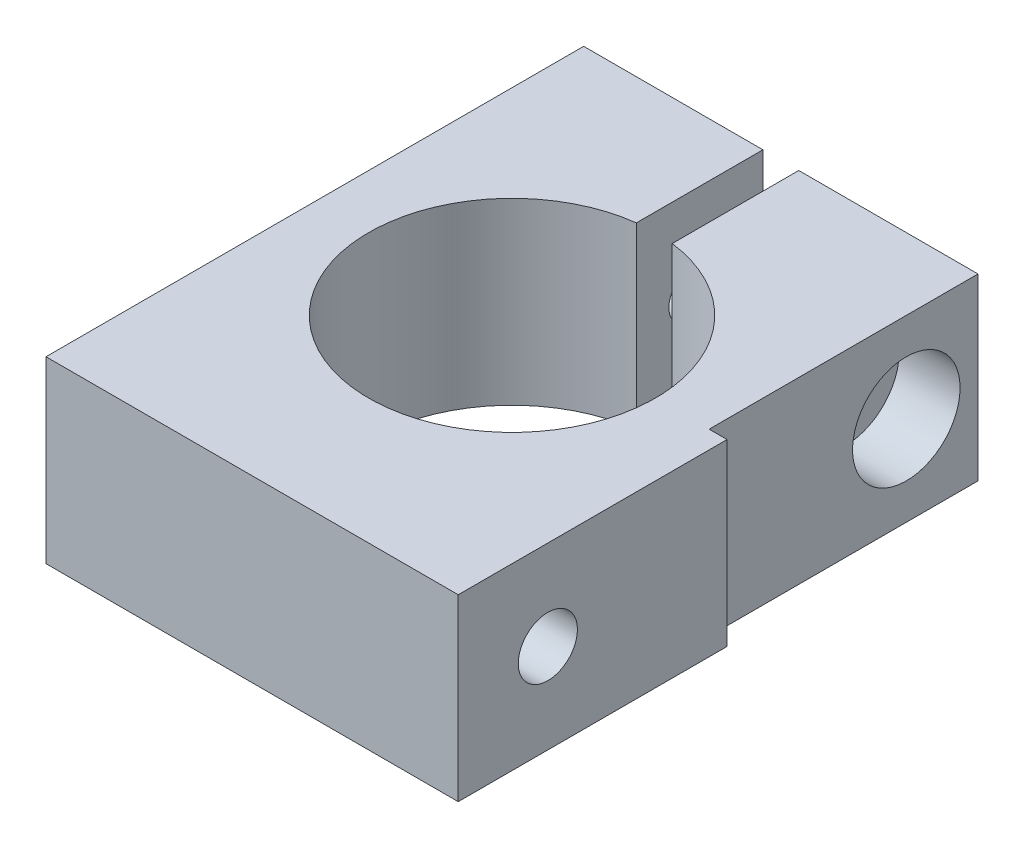
ISO-10303-21;
HEADER;
FILE_DESCRIPTION(('STEP AP214'),'2;1');
FILE_NAME('part.step','',(''),(''),'','','');
FILE_SCHEMA(('AUTOMOTIVE_DESIGN { 1 0 10303 214 1 1 1 1 }'));
ENDSEC;
DATA;
#1=APPLICATION_CONTEXT('core data for automotive mechanical design processes');
#2=APPLICATION_PROTOCOL_DEFINITION('international standard','automotive_design',2000,#1);
#3=PRODUCT_CONTEXT('',#1,'mechanical');
#4=PRODUCT('Part','Part','',(#3));
#5=PRODUCT_RELATED_PRODUCT_CATEGORY('part','',(#4));
#6=PRODUCT_DEFINITION_FORMATION('','',#4);
#7=PRODUCT_DEFINITION_CONTEXT('part definition',#1,'design');
#8=PRODUCT_DEFINITION('design','',#6,#7);
#9=PRODUCT_DEFINITION_SHAPE('','',#8);
#10=(LENGTH_UNIT() NAMED_UNIT(*) SI_UNIT(.MILLI.,.METRE.));
#11=(NAMED_UNIT(*) PLANE_ANGLE_UNIT() SI_UNIT($,.RADIAN.));
#12=(NAMED_UNIT(*) SI_UNIT($,.STERADIAN.) SOLID_ANGLE_UNIT());
#13=UNCERTAINTY_MEASURE_WITH_UNIT(LENGTH_MEASURE(1.E-05),#10,'distance_accuracy_value','');
#14=(GEOMETRIC_REPRESENTATION_CONTEXT(3) GLOBAL_UNCERTAINTY_ASSIGNED_CONTEXT((#13)) GLOBAL_UNIT_ASSIGNED_CONTEXT((#10,
#11,#12)) REPRESENTATION_CONTEXT('',''));
#15=CARTESIAN_POINT('',(0.,0.,0.));
#16=DIRECTION('',(0.,0.,1.));
#17=DIRECTION('',(1.,0.,0.));
#18=AXIS2_PLACEMENT_3D('',#15,#16,#17);
#19=CARTESIAN_POINT('',(11.,5.,15.));
#20=DIRECTION('',(-1.,0.,0.));
#21=DIRECTION('',(0.,0.,1.));
#22=AXIS2_PLACEMENT_3D('',#19,#20,#21);
#23=PLANE('',#22);
#24=CARTESIAN_POINT('',(11.,0.,-11.));
#25=DIRECTION('',(1.,0.,0.));
#26=DIRECTION('',(0.,0.,-1.));
#27=AXIS2_PLACEMENT_3D('',#24,#25,#26);
#28=CIRCLE('',#27,3.);
#29=CARTESIAN_POINT('',(11.,0.,-14.));
#30=VERTEX_POINT('',#29);
#31=EDGE_CURVE('E235',#30,#30,#28,.T.);
#32=ORIENTED_EDGE('',*,*,#31,.F.);
#33=EDGE_LOOP('',(#32));
#34=FACE_BOUND('',#33,.T.);
#35=DIRECTION('',(0.,1.,0.));
#36=VECTOR('',#35,1.);
#37=CARTESIAN_POINT('',(11.,-4.99999999999999,0.));
#38=LINE('',#37,#36);
#39=CARTESIAN_POINT('',(11.,-4.99999999999999,0.));
#40=VERTEX_POINT('',#39);
#41=CARTESIAN_POINT('',(11.,5.,0.));
#42=VERTEX_POINT('',#41);
#43=EDGE_CURVE('E87',#40,#42,#38,.T.);
#44=ORIENTED_EDGE('',*,*,#43,.F.);
#45=DIRECTION('',(0.,0.,-1.));
#46=VECTOR('',#45,1.);
#47=CARTESIAN_POINT('',(11.,-5.,15.));
#48=LINE('',#47,#46);
#49=CARTESIAN_POINT('',(11.,-5.,-15.));
#50=VERTEX_POINT('',#49);
#51=EDGE_CURVE('E204',#40,#50,#48,.T.);
#52=ORIENTED_EDGE('',*,*,#51,.T.);
#53=DIRECTION('',(0.,-1.,0.));
#54=VECTOR('',#53,1.);
#55=CARTESIAN_POINT('',(11.,4.99999999999999,-15.));
#56=LINE('',#55,#54);
#57=CARTESIAN_POINT('',(11.,4.99999999999999,-15.));
#58=VERTEX_POINT('',#57);
#59=EDGE_CURVE('E243',#58,#50,#56,.T.);
#60=ORIENTED_EDGE('',*,*,#59,.F.);
#61=DIRECTION('',(0.,0.,-1.));
#62=VECTOR('',#61,1.);
#63=CARTESIAN_POINT('',(11.,5.,15.));
#64=LINE('',#63,#62);
#65=EDGE_CURVE('E213',#42,#58,#64,.T.);
#66=ORIENTED_EDGE('',*,*,#65,.F.);
#67=EDGE_LOOP('',(#44,#52,#60,#66));
#68=FACE_BOUND('',#67,.T.);
#69=ADVANCED_FACE('F66',(#34,#68),#23,.F.);
#70=CARTESIAN_POINT('',(-1.,5.,-15.));
#71=DIRECTION('',(0.,0.,1.));
#72=DIRECTION('',(1.,0.,0.));
#73=AXIS2_PLACEMENT_3D('',#70,#71,#72);
#74=PLANE('',#73);
#75=DIRECTION('',(-1.,0.,0.));
#76=VECTOR('',#75,1.);
#77=CARTESIAN_POINT('',(-1.,-4.99999999999999,-15.));
#78=LINE('',#77,#76);
#79=CARTESIAN_POINT('',(-1.,-4.99999999999999,-15.));
#80=VERTEX_POINT('',#79);
#81=CARTESIAN_POINT('',(-11.,-5.,-15.));
#82=VERTEX_POINT('',#81);
#83=EDGE_CURVE('E193',#80,#82,#78,.T.);
#84=ORIENTED_EDGE('',*,*,#83,.T.);
#85=DIRECTION('',(0.,-1.,0.));
#86=VECTOR('',#85,1.);
#87=CARTESIAN_POINT('',(-11.,5.,-15.));
#88=LINE('',#87,#86);
#89=CARTESIAN_POINT('',(-11.,5.,-15.));
#90=VERTEX_POINT('',#89);
#91=EDGE_CURVE('E14',#90,#82,#88,.T.);
#92=ORIENTED_EDGE('',*,*,#91,.F.);
#93=DIRECTION('',(-1.,0.,0.));
#94=VECTOR('',#93,1.);
#95=CARTESIAN_POINT('',(-1.,5.,-15.));
#96=LINE('',#95,#94);
#97=CARTESIAN_POINT('',(-1.,5.,-15.));
#98=VERTEX_POINT('',#97);
#99=EDGE_CURVE('E277',#98,#90,#96,.T.);
#100=ORIENTED_EDGE('',*,*,#99,.F.);
#101=DIRECTION('',(0.,-1.,0.));
#102=VECTOR('',#101,1.);
#103=CARTESIAN_POINT('',(-1.,5.,-15.));
#104=LINE('',#103,#102);
#105=EDGE_CURVE('E189',#98,#80,#104,.T.);
#106=ORIENTED_EDGE('',*,*,#105,.T.);
#107=EDGE_LOOP('',(#84,#92,#100,#106));
#108=FACE_BOUND('',#107,.T.);
#109=ADVANCED_FACE('F68',(#108),#74,.F.);
#110=CARTESIAN_POINT('',(-11.,5.,15.));
#111=DIRECTION('',(1.,0.,0.));
#112=DIRECTION('',(0.,0.,-1.));
#113=AXIS2_PLACEMENT_3D('',#110,#111,#112);
#114=PLANE('',#113);
#115=CARTESIAN_POINT('',(-11.,0.,-11.));
#116=DIRECTION('',(-1.,0.,0.));
#117=DIRECTION('',(0.,0.,1.));
#118=AXIS2_PLACEMENT_3D('',#115,#116,#117);
#119=CIRCLE('',#118,1.24999999999999);
#120=CARTESIAN_POINT('',(-11.,0.,-9.75000000000001));
#121=VERTEX_POINT('',#120);
#122=EDGE_CURVE('E261',#121,#121,#119,.T.);
#123=ORIENTED_EDGE('',*,*,#122,.F.);
#124=EDGE_LOOP('',(#123));
#125=FACE_BOUND('',#124,.T.);
#126=DIRECTION('',(0.,0.,1.));
#127=VECTOR('',#126,1.);
#128=CARTESIAN_POINT('',(-11.,-4.99999999999999,15.));
#129=LINE('',#128,#127);
#130=CARTESIAN_POINT('',(-11.,-4.99999999999999,15.));
#131=VERTEX_POINT('',#130);
#132=EDGE_CURVE('E197',#82,#131,#129,.T.);
#133=ORIENTED_EDGE('',*,*,#132,.T.);
#134=DIRECTION('',(0.,-1.,0.));
#135=VECTOR('',#134,1.);
#136=CARTESIAN_POINT('',(-11.,5.,15.));
#137=LINE('',#136,#135);
#138=CARTESIAN_POINT('',(-11.,5.,15.));
#139=VERTEX_POINT('',#138);
#140=EDGE_CURVE('E76',#139,#131,#137,.T.);
#141=ORIENTED_EDGE('',*,*,#140,.F.);
#142=DIRECTION('',(0.,0.,1.));
#143=VECTOR('',#142,1.);
#144=CARTESIAN_POINT('',(-11.,5.,15.));
#145=LINE('',#144,#143);
#146=EDGE_CURVE('E145',#90,#139,#145,.T.);
#147=ORIENTED_EDGE('',*,*,#146,.F.);
#148=ORIENTED_EDGE('',*,*,#91,.T.);
#149=EDGE_LOOP('',(#133,#141,#147,#148));
#150=FACE_BOUND('',#149,.T.);
#151=ADVANCED_FACE('F312',(#125,#150),#114,.F.);
#152=CARTESIAN_POINT('',(11.,5.,15.));
#153=DIRECTION('',(0.,0.,-1.));
#154=DIRECTION('',(-1.,0.,0.));
#155=AXIS2_PLACEMENT_3D('',#152,#153,#154);
#156=PLANE('',#155);
#157=DIRECTION('',(1.,0.,0.));
#158=VECTOR('',#157,1.);
#159=CARTESIAN_POINT('',(11.,-5.,15.));
#160=LINE('',#159,#158);
#161=CARTESIAN_POINT('',(12.,-5.,15.));
#162=VERTEX_POINT('',#161);
#163=EDGE_CURVE('E201',#131,#162,#160,.T.);
#164=ORIENTED_EDGE('',*,*,#163,.T.);
#165=DIRECTION('',(0.,-1.,0.));
#166=VECTOR('',#165,1.);
#167=CARTESIAN_POINT('',(12.,-5.,15.));
#168=LINE('',#167,#166);
#169=CARTESIAN_POINT('',(12.,5.,15.));
#170=VERTEX_POINT('',#169);
#171=EDGE_CURVE('E252',#170,#162,#168,.T.);
#172=ORIENTED_EDGE('',*,*,#171,.F.);
#173=DIRECTION('',(1.,0.,0.));
#174=VECTOR('',#173,1.);
#175=CARTESIAN_POINT('',(11.,5.,15.));
#176=LINE('',#175,#174);
#177=EDGE_CURVE('E217',#139,#170,#176,.T.);
#178=ORIENTED_EDGE('',*,*,#177,.F.);
#179=ORIENTED_EDGE('',*,*,#140,.T.);
#180=EDGE_LOOP('',(#164,#172,#178,#179));
#181=FACE_BOUND('',#180,.T.);
#182=ADVANCED_FACE('F314',(#181),#156,.F.);
#183=CARTESIAN_POINT('',(11.,4.99999999999999,-15.));
#184=DIRECTION('',(0.,0.,1.));
#185=DIRECTION('',(1.,0.,0.));
#186=AXIS2_PLACEMENT_3D('',#183,#184,#185);
#187=PLANE('',#186);
#188=DIRECTION('',(-1.,0.,0.));
#189=VECTOR('',#188,1.);
#190=CARTESIAN_POINT('',(11.,-5.,-15.));
#191=LINE('',#190,#189);
#192=CARTESIAN_POINT('',(1.,-4.99999999999999,-15.));
#193=VERTEX_POINT('',#192);
#194=EDGE_CURVE('E207',#50,#193,#191,.T.);
#195=ORIENTED_EDGE('',*,*,#194,.T.);
#196=DIRECTION('',(0.,-1.,0.));
#197=VECTOR('',#196,1.);
#198=CARTESIAN_POINT('',(1.,5.,-15.));
#199=LINE('',#198,#197);
#200=CARTESIAN_POINT('',(1.,5.,-15.));
#201=VERTEX_POINT('',#200);
#202=EDGE_CURVE('E181',#201,#193,#199,.T.);
#203=ORIENTED_EDGE('',*,*,#202,.F.);
#204=DIRECTION('',(-1.,0.,0.));
#205=VECTOR('',#204,1.);
#206=CARTESIAN_POINT('',(11.,4.99999999999999,-15.));
#207=LINE('',#206,#205);
#208=EDGE_CURVE('E167',#58,#201,#207,.T.);
#209=ORIENTED_EDGE('',*,*,#208,.F.);
#210=ORIENTED_EDGE('',*,*,#59,.T.);
#211=EDGE_LOOP('',(#195,#203,#209,#210));
#212=FACE_BOUND('',#211,.T.);
#213=ADVANCED_FACE('F320',(#212),#187,.F.);
#214=CARTESIAN_POINT('',(1.,5.,-15.));
#215=DIRECTION('',(1.,0.,0.));
#216=DIRECTION('',(0.,0.,-1.));
#217=AXIS2_PLACEMENT_3D('',#214,#215,#216);
#218=PLANE('',#217);
#219=CARTESIAN_POINT('',(1.,0.,-11.));
#220=DIRECTION('',(1.,0.,0.));
#221=DIRECTION('',(0.,0.,-1.));
#222=AXIS2_PLACEMENT_3D('',#219,#220,#221);
#223=CIRCLE('',#222,1.6);
#224=CARTESIAN_POINT('',(1.,0.,-12.6));
#225=VERTEX_POINT('',#224);
#226=EDGE_CURVE('E198',#225,#225,#223,.T.);
#227=ORIENTED_EDGE('',*,*,#226,.T.);
#228=EDGE_LOOP('',(#227));
#229=FACE_BOUND('',#228,.T.);
#230=DIRECTION('',(0.,0.,1.));
#231=VECTOR('',#230,1.);
#232=CARTESIAN_POINT('',(1.,-4.99999999999999,-15.));
#233=LINE('',#232,#231);
#234=CARTESIAN_POINT('',(1.,-4.99999999999999,-7.93725393319379));
#235=VERTEX_POINT('',#234);
#236=EDGE_CURVE('E177',#193,#235,#233,.T.);
#237=ORIENTED_EDGE('',*,*,#236,.T.);
#238=DIRECTION('',(0.,-1.,0.));
#239=VECTOR('',#238,1.);
#240=CARTESIAN_POINT('',(0.999999999999997,5.,-7.9372539331938));
#241=LINE('',#240,#239);
#242=CARTESIAN_POINT('',(0.999999999999997,5.,-7.9372539331938));
#243=VERTEX_POINT('',#242);
#244=EDGE_CURVE('E174',#243,#235,#241,.T.);
#245=ORIENTED_EDGE('',*,*,#244,.F.);
#246=DIRECTION('',(0.,0.,1.));
#247=VECTOR('',#246,1.);
#248=CARTESIAN_POINT('',(1.,5.,-15.));
#249=LINE('',#248,#247);
#250=EDGE_CURVE('E160',#201,#243,#249,.T.);
#251=ORIENTED_EDGE('',*,*,#250,.F.);
#252=ORIENTED_EDGE('',*,*,#202,.T.);
#253=EDGE_LOOP('',(#237,#245,#251,#252));
#254=FACE_BOUND('',#253,.T.);
#255=ADVANCED_FACE('F175',(#229,#254),#218,.F.);
#256=CARTESIAN_POINT('',(0.,5.,0.));
#257=DIRECTION('',(0.,-1.,0.));
#258=DIRECTION('',(0.,0.,-1.));
#259=AXIS2_PLACEMENT_3D('',#256,#257,#258);
#260=CYLINDRICAL_SURFACE('',#259,8.);
#261=CARTESIAN_POINT('',(0.,-5.,0.));
#262=DIRECTION('',(0.,-1.,0.));
#263=DIRECTION('',(0.,0.,1.));
#264=AXIS2_PLACEMENT_3D('',#261,#262,#263);
#265=CIRCLE('',#264,8.);
#266=CARTESIAN_POINT('',(-1.00000000000001,-4.99999999999999,-7.93725393319379));
#267=VERTEX_POINT('',#266);
#268=EDGE_CURVE('E240',#235,#267,#265,.T.);
#269=ORIENTED_EDGE('',*,*,#268,.T.);
#270=DIRECTION('',(0.,-1.,0.));
#271=VECTOR('',#270,1.);
#272=CARTESIAN_POINT('',(-1.,5.,-7.9372539331938));
#273=LINE('',#272,#271);
#274=CARTESIAN_POINT('',(-1.,5.,-7.9372539331938));
#275=VERTEX_POINT('',#274);
#276=EDGE_CURVE('E182',#275,#267,#273,.T.);
#277=ORIENTED_EDGE('',*,*,#276,.F.);
#278=CARTESIAN_POINT('',(0.,5.,0.));
#279=DIRECTION('',(0.,-1.,0.));
#280=DIRECTION('',(0.,0.,1.));
#281=AXIS2_PLACEMENT_3D('',#278,#279,#280);
#282=CIRCLE('',#281,8.);
#283=EDGE_CURVE('E164',#243,#275,#282,.T.);
#284=ORIENTED_EDGE('',*,*,#283,.F.);
#285=ORIENTED_EDGE('',*,*,#244,.T.);
#286=EDGE_LOOP('',(#269,#277,#284,#285));
#287=FACE_BOUND('',#286,.T.);
#288=ADVANCED_FACE('F184',(#287),#260,.F.);
#289=CARTESIAN_POINT('',(-1.,5.,-15.));
#290=DIRECTION('',(-1.,0.,0.));
#291=DIRECTION('',(0.,0.,1.));
#292=AXIS2_PLACEMENT_3D('',#289,#290,#291);
#293=PLANE('',#292);
#294=CARTESIAN_POINT('',(-1.,0.,-11.));
#295=DIRECTION('',(-1.,0.,0.));
#296=DIRECTION('',(0.,0.,1.));
#297=AXIS2_PLACEMENT_3D('',#294,#295,#296);
#298=CIRCLE('',#297,1.24999999999999);
#299=CARTESIAN_POINT('',(-1.,0.,-9.75000000000001));
#300=VERTEX_POINT('',#299);
#301=EDGE_CURVE('E249',#300,#300,#298,.T.);
#302=ORIENTED_EDGE('',*,*,#301,.T.);
#303=EDGE_LOOP('',(#302));
#304=FACE_BOUND('',#303,.T.);
#305=DIRECTION('',(0.,0.,-1.));
#306=VECTOR('',#305,1.);
#307=CARTESIAN_POINT('',(-1.,-4.99999999999999,-15.));
#308=LINE('',#307,#306);
#309=EDGE_CURVE('E135',#267,#80,#308,.T.);
#310=ORIENTED_EDGE('',*,*,#309,.T.);
#311=ORIENTED_EDGE('',*,*,#105,.F.);
#312=DIRECTION('',(0.,0.,-1.));
#313=VECTOR('',#312,1.);
#314=CARTESIAN_POINT('',(-1.,5.,-15.));
#315=LINE('',#314,#313);
#316=EDGE_CURVE('E98',#275,#98,#315,.T.);
#317=ORIENTED_EDGE('',*,*,#316,.F.);
#318=ORIENTED_EDGE('',*,*,#276,.T.);
#319=EDGE_LOOP('',(#310,#311,#317,#318));
#320=FACE_BOUND('',#319,.T.);
#321=ADVANCED_FACE('F338',(#304,#320),#293,.F.);
#322=CARTESIAN_POINT('',(0.,5.,0.));
#323=DIRECTION('',(0.,1.,0.));
#324=DIRECTION('',(0.,0.,1.));
#325=AXIS2_PLACEMENT_3D('',#322,#323,#324);
#326=PLANE('',#325);
#327=ORIENTED_EDGE('',*,*,#99,.T.);
#328=ORIENTED_EDGE('',*,*,#146,.T.);
#329=ORIENTED_EDGE('',*,*,#177,.T.);
#330=DIRECTION('',(0.,0.,1.));
#331=VECTOR('',#330,1.);
#332=CARTESIAN_POINT('',(12.,5.,15.));
#333=LINE('',#332,#331);
#334=CARTESIAN_POINT('',(12.,5.,0.));
#335=VERTEX_POINT('',#334);
#336=EDGE_CURVE('E256',#335,#170,#333,.T.);
#337=ORIENTED_EDGE('',*,*,#336,.F.);
#338=DIRECTION('',(-1.,0.,0.));
#339=VECTOR('',#338,1.);
#340=CARTESIAN_POINT('',(12.,5.,0.));
#341=LINE('',#340,#339);
#342=EDGE_CURVE('E262',#335,#42,#341,.T.);
#343=ORIENTED_EDGE('',*,*,#342,.T.);
#344=ORIENTED_EDGE('',*,*,#65,.T.);
#345=ORIENTED_EDGE('',*,*,#208,.T.);
#346=ORIENTED_EDGE('',*,*,#250,.T.);
#347=ORIENTED_EDGE('',*,*,#283,.T.);
#348=ORIENTED_EDGE('',*,*,#316,.T.);
#349=EDGE_LOOP('',(#327,#328,#329,#337,#343,#344,#345,#346,#347,#348));
#350=FACE_BOUND('',#349,.T.);
#351=ADVANCED_FACE('F162',(#350),#326,.T.);
#352=CARTESIAN_POINT('',(0.,-5.,0.));
#353=DIRECTION('',(0.,1.,0.));
#354=DIRECTION('',(0.,0.,1.));
#355=AXIS2_PLACEMENT_3D('',#352,#353,#354);
#356=PLANE('',#355);
#357=ORIENTED_EDGE('',*,*,#83,.F.);
#358=ORIENTED_EDGE('',*,*,#309,.F.);
#359=ORIENTED_EDGE('',*,*,#268,.F.);
#360=ORIENTED_EDGE('',*,*,#236,.F.);
#361=ORIENTED_EDGE('',*,*,#194,.F.);
#362=ORIENTED_EDGE('',*,*,#51,.F.);
#363=DIRECTION('',(-1.,0.,0.));
#364=VECTOR('',#363,1.);
#365=CARTESIAN_POINT('',(12.,-4.99999999999999,0.));
#366=LINE('',#365,#364);
#367=CARTESIAN_POINT('',(12.,-4.99999999999999,0.));
#368=VERTEX_POINT('',#367);
#369=EDGE_CURVE('E259',#368,#40,#366,.T.);
#370=ORIENTED_EDGE('',*,*,#369,.F.);
#371=DIRECTION('',(0.,0.,-1.));
#372=VECTOR('',#371,1.);
#373=CARTESIAN_POINT('',(12.,-5.,15.));
#374=LINE('',#373,#372);
#375=EDGE_CURVE('E257',#162,#368,#374,.T.);
#376=ORIENTED_EDGE('',*,*,#375,.F.);
#377=ORIENTED_EDGE('',*,*,#163,.F.);
#378=ORIENTED_EDGE('',*,*,#132,.F.);
#379=EDGE_LOOP('',(#357,#358,#359,#360,#361,#362,#370,#376,#377,#378));
#380=FACE_BOUND('',#379,.T.);
#381=ADVANCED_FACE('F310',(#380),#356,.F.);
#382=CARTESIAN_POINT('',(11.,0.,-11.));
#383=DIRECTION('',(1.,0.,0.));
#384=DIRECTION('',(0.,0.,-1.));
#385=AXIS2_PLACEMENT_3D('',#382,#383,#384);
#386=CYLINDRICAL_SURFACE('',#385,1.6);
#387=ORIENTED_EDGE('',*,*,#226,.F.);
#388=EDGE_LOOP('',(#387));
#389=FACE_BOUND('',#388,.T.);
#390=CARTESIAN_POINT('',(7.6,0.,-11.));
#391=DIRECTION('',(1.,0.,0.));
#392=DIRECTION('',(0.,0.,-1.));
#393=AXIS2_PLACEMENT_3D('',#390,#391,#392);
#394=CIRCLE('',#393,1.6);
#395=CARTESIAN_POINT('',(7.6,0.,-12.6));
#396=VERTEX_POINT('',#395);
#397=EDGE_CURVE('E234',#396,#396,#394,.T.);
#398=ORIENTED_EDGE('',*,*,#397,.T.);
#399=EDGE_LOOP('',(#398));
#400=FACE_BOUND('',#399,.T.);
#401=ADVANCED_FACE('F344',(#389,#400),#386,.F.);
#402=CARTESIAN_POINT('',(7.6,1.6,-11.));
#403=DIRECTION('',(-1.,0.,0.));
#404=DIRECTION('',(0.,0.,1.));
#405=AXIS2_PLACEMENT_3D('',#402,#403,#404);
#406=PLANE('',#405);
#407=ORIENTED_EDGE('',*,*,#397,.F.);
#408=EDGE_LOOP('',(#407));
#409=FACE_BOUND('',#408,.T.);
#410=CARTESIAN_POINT('',(7.6,0.,-11.));
#411=DIRECTION('',(1.,0.,0.));
#412=DIRECTION('',(0.,0.,-1.));
#413=AXIS2_PLACEMENT_3D('',#410,#411,#412);
#414=CIRCLE('',#413,3.);
#415=CARTESIAN_POINT('',(7.6,0.,-14.));
#416=VERTEX_POINT('',#415);
#417=EDGE_CURVE('E231',#416,#416,#414,.T.);
#418=ORIENTED_EDGE('',*,*,#417,.T.);
#419=EDGE_LOOP('',(#418));
#420=FACE_BOUND('',#419,.T.);
#421=ADVANCED_FACE('F349',(#409,#420),#406,.F.);
#422=CARTESIAN_POINT('',(11.,0.,-11.));
#423=DIRECTION('',(1.,0.,0.));
#424=DIRECTION('',(0.,0.,-1.));
#425=AXIS2_PLACEMENT_3D('',#422,#423,#424);
#426=CYLINDRICAL_SURFACE('',#425,3.);
#427=ORIENTED_EDGE('',*,*,#417,.F.);
#428=EDGE_LOOP('',(#427));
#429=FACE_BOUND('',#428,.T.);
#430=ORIENTED_EDGE('',*,*,#31,.T.);
#431=EDGE_LOOP('',(#430));
#432=FACE_BOUND('',#431,.T.);
#433=ADVANCED_FACE('F353',(#429,#432),#426,.F.);
#434=CARTESIAN_POINT('',(-11.,0.,-11.));
#435=DIRECTION('',(-1.,0.,0.));
#436=DIRECTION('',(0.,0.,1.));
#437=AXIS2_PLACEMENT_3D('',#434,#435,#436);
#438=CYLINDRICAL_SURFACE('',#437,1.24999999999999);
#439=ORIENTED_EDGE('',*,*,#301,.F.);
#440=EDGE_LOOP('',(#439));
#441=FACE_BOUND('',#440,.T.);
#442=ORIENTED_EDGE('',*,*,#122,.T.);
#443=EDGE_LOOP('',(#442));
#444=FACE_BOUND('',#443,.T.);
#445=ADVANCED_FACE('F357',(#441,#444),#438,.F.);
#446=CARTESIAN_POINT('',(12.,-4.99999999999999,0.));
#447=DIRECTION('',(0.,0.,1.));
#448=DIRECTION('',(1.,0.,0.));
#449=AXIS2_PLACEMENT_3D('',#446,#447,#448);
#450=PLANE('',#449);
#451=ORIENTED_EDGE('',*,*,#43,.T.);
#452=ORIENTED_EDGE('',*,*,#342,.F.);
#453=DIRECTION('',(0.,1.,0.));
#454=VECTOR('',#453,1.);
#455=CARTESIAN_POINT('',(12.,-4.99999999999999,0.));
#456=LINE('',#455,#454);
#457=EDGE_CURVE('E253',#368,#335,#456,.T.);
#458=ORIENTED_EDGE('',*,*,#457,.F.);
#459=ORIENTED_EDGE('',*,*,#369,.T.);
#460=EDGE_LOOP('',(#451,#452,#458,#459));
#461=FACE_BOUND('',#460,.T.);
#462=ADVANCED_FACE('F361',(#461),#450,.F.);
#463=CARTESIAN_POINT('',(12.,0.,0.));
#464=DIRECTION('',(-1.,0.,0.));
#465=DIRECTION('',(0.,0.,1.));
#466=AXIS2_PLACEMENT_3D('',#463,#464,#465);
#467=PLANE('',#466);
#468=CARTESIAN_POINT('',(12.,0.,10.));
#469=DIRECTION('',(1.,0.,0.));
#470=DIRECTION('',(0.,0.,-1.));
#471=AXIS2_PLACEMENT_3D('',#468,#469,#470);
#472=CIRCLE('',#471,1.64999999999999);
#473=CARTESIAN_POINT('',(12.,0.,8.35000000000001));
#474=VERTEX_POINT('',#473);
#475=EDGE_CURVE('E229',#474,#474,#472,.T.);
#476=ORIENTED_EDGE('',*,*,#475,.F.);
#477=EDGE_LOOP('',(#476));
#478=FACE_BOUND('',#477,.T.);
#479=ORIENTED_EDGE('',*,*,#171,.T.);
#480=ORIENTED_EDGE('',*,*,#375,.T.);
#481=ORIENTED_EDGE('',*,*,#457,.T.);
#482=ORIENTED_EDGE('',*,*,#336,.T.);
#483=EDGE_LOOP('',(#479,#480,#481,#482));
#484=FACE_BOUND('',#483,.T.);
#485=ADVANCED_FACE('F365',(#478,#484),#467,.F.);
#486=CARTESIAN_POINT('',(2.5,0.,10.));
#487=DIRECTION('',(1.,0.,0.));
#488=DIRECTION('',(0.,0.,-1.));
#489=AXIS2_PLACEMENT_3D('',#486,#487,#488);
#490=CONICAL_SURFACE('',#489,1.64999999999999,1.02974425867665);
#491=CARTESIAN_POINT('',(1.50857997860452,0.,10.));
#492=VERTEX_POINT('',#491);
#493=VERTEX_LOOP('',#492);
#494=FACE_BOUND('',#493,.T.);
#495=CARTESIAN_POINT('',(2.5,0.,10.));
#496=DIRECTION('',(1.,0.,0.));
#497=DIRECTION('',(0.,0.,-1.));
#498=AXIS2_PLACEMENT_3D('',#495,#496,#497);
#499=CIRCLE('',#498,1.64999999999999);
#500=CARTESIAN_POINT('',(2.5,0.,8.35000000000002));
#501=VERTEX_POINT('',#500);
#502=EDGE_CURVE('E226',#501,#501,#499,.T.);
#503=ORIENTED_EDGE('',*,*,#502,.T.);
#504=EDGE_LOOP('',(#503));
#505=FACE_BOUND('',#504,.T.);
#506=ADVANCED_FACE('F369',(#494,#505),#490,.F.);
#507=CARTESIAN_POINT('',(12.,0.,10.));
#508=DIRECTION('',(1.,0.,0.));
#509=DIRECTION('',(0.,0.,-1.));
#510=AXIS2_PLACEMENT_3D('',#507,#508,#509);
#511=CYLINDRICAL_SURFACE('',#510,1.64999999999999);
#512=ORIENTED_EDGE('',*,*,#502,.F.);
#513=EDGE_LOOP('',(#512));
#514=FACE_BOUND('',#513,.T.);
#515=ORIENTED_EDGE('',*,*,#475,.T.);
#516=EDGE_LOOP('',(#515));
#517=FACE_BOUND('',#516,.T.);
#518=ADVANCED_FACE('F373',(#514,#517),#511,.F.);
#519=CLOSED_SHELL('',(#69,#109,#151,#182,#213,#255,#288,#321,#351,#381,#401,#421,#433,#445,#462,
#485,#506,#518));
#520=MANIFOLD_SOLID_BREP('B2',#519);
#521=ADVANCED_BREP_SHAPE_REPRESENTATION('',(#18,#520),#14);
#522=SHAPE_DEFINITION_REPRESENTATION(#9,#521);
ENDSEC;
END-ISO-10303-21;
